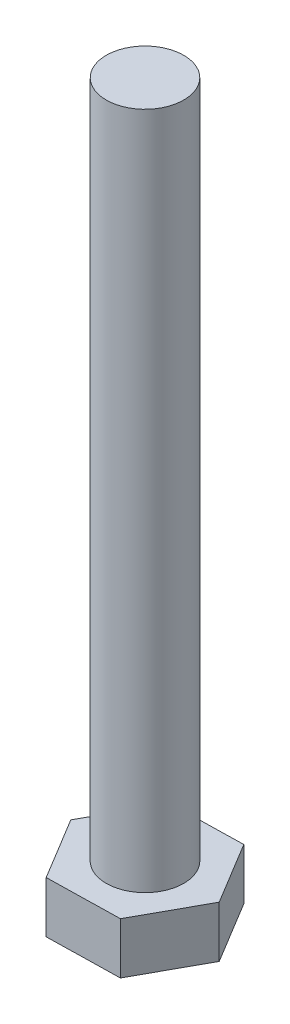
ISO-10303-21;
HEADER;
FILE_DESCRIPTION(('STEP AP214'),'2;1');
FILE_NAME('part.step','',(''),(''),'','','');
FILE_SCHEMA(('AUTOMOTIVE_DESIGN { 1 0 10303 214 1 1 1 1 }'));
ENDSEC;
DATA;
#1=APPLICATION_CONTEXT('core data for automotive mechanical design processes');
#2=APPLICATION_PROTOCOL_DEFINITION('international standard','automotive_design',2000,#1);
#3=PRODUCT_CONTEXT('',#1,'mechanical');
#4=PRODUCT('Part','Part','',(#3));
#5=PRODUCT_RELATED_PRODUCT_CATEGORY('part','',(#4));
#6=PRODUCT_DEFINITION_FORMATION('','',#4);
#7=PRODUCT_DEFINITION_CONTEXT('part definition',#1,'design');
#8=PRODUCT_DEFINITION('design','',#6,#7);
#9=PRODUCT_DEFINITION_SHAPE('','',#8);
#10=(LENGTH_UNIT() NAMED_UNIT(*) SI_UNIT(.MILLI.,.METRE.));
#11=(NAMED_UNIT(*) PLANE_ANGLE_UNIT() SI_UNIT($,.RADIAN.));
#12=(NAMED_UNIT(*) SI_UNIT($,.STERADIAN.) SOLID_ANGLE_UNIT());
#13=UNCERTAINTY_MEASURE_WITH_UNIT(LENGTH_MEASURE(1.E-05),#10,'distance_accuracy_value','');
#14=(GEOMETRIC_REPRESENTATION_CONTEXT(3) GLOBAL_UNCERTAINTY_ASSIGNED_CONTEXT((#13)) GLOBAL_UNIT_ASSIGNED_CONTEXT((#10,
#11,#12)) REPRESENTATION_CONTEXT('',''));
#15=CARTESIAN_POINT('',(0.,0.,0.));
#16=DIRECTION('',(0.,0.,1.));
#17=DIRECTION('',(1.,0.,0.));
#18=AXIS2_PLACEMENT_3D('',#15,#16,#17);
#19=CARTESIAN_POINT('',(-3.62049862835337,5.3,6.57459679489356));
#20=DIRECTION('',(-0.0202323001144248,0.,-0.999795306066237));
#21=DIRECTION('',(-0.999795306066237,0.,0.0202323001144248));
#22=AXIS2_PLACEMENT_3D('',#19,#20,#21);
#23=PLANE('',#22);
#24=DIRECTION('',(0.999795306066237,0.,-0.0202323001144248));
#25=VECTOR('',#24,1.);
#26=CARTESIAN_POINT('',(-3.62049862835337,0.,6.57459679489356));
#27=LINE('',#26,#25);
#28=CARTESIAN_POINT('',(-3.62049862835337,0.,6.57459679489356));
#29=VERTEX_POINT('',#28);
#30=CARTESIAN_POINT('',(3.88351852984089,0.,6.42274218396752));
#31=VERTEX_POINT('',#30);
#32=EDGE_CURVE('E130',#29,#31,#27,.T.);
#33=ORIENTED_EDGE('',*,*,#32,.T.);
#34=DIRECTION('',(0.,-1.,0.));
#35=VECTOR('',#34,1.);
#36=CARTESIAN_POINT('',(3.88351852984089,5.3,6.42274218396752));
#37=LINE('',#36,#35);
#38=CARTESIAN_POINT('',(3.88351852984089,5.3,6.42274218396752));
#39=VERTEX_POINT('',#38);
#40=EDGE_CURVE('E42',#39,#31,#37,.T.);
#41=ORIENTED_EDGE('',*,*,#40,.F.);
#42=DIRECTION('',(0.999795306066237,0.,-0.0202323001144248));
#43=VECTOR('',#42,1.);
#44=CARTESIAN_POINT('',(-3.62049862835337,5.3,6.57459679489356));
#45=LINE('',#44,#43);
#46=CARTESIAN_POINT('',(-3.62049862835337,5.3,6.57459679489356));
#47=VERTEX_POINT('',#46);
#48=EDGE_CURVE('E147',#47,#39,#45,.T.);
#49=ORIENTED_EDGE('',*,*,#48,.F.);
#50=DIRECTION('',(0.,-1.,0.));
#51=VECTOR('',#50,1.);
#52=CARTESIAN_POINT('',(-3.62049862835337,5.3,6.57459679489356));
#53=LINE('',#52,#51);
#54=EDGE_CURVE('E126',#47,#29,#53,.T.);
#55=ORIENTED_EDGE('',*,*,#54,.T.);
#56=EDGE_LOOP('',(#33,#41,#49,#55));
#57=FACE_BOUND('',#56,.T.);
#58=ADVANCED_FACE('F39',(#57),#23,.F.);
#59=CARTESIAN_POINT('',(3.88351852984089,5.3,6.42274218396752));
#60=DIRECTION('',(-0.875964283695011,0.,-0.482375967157036));
#61=DIRECTION('',(-0.482375967157036,0.,0.875964283695011));
#62=AXIS2_PLACEMENT_3D('',#59,#60,#61);
#63=PLANE('',#62);
#64=DIRECTION('',(0.482375967157036,0.,-0.875964283695011));
#65=VECTOR('',#64,1.);
#66=CARTESIAN_POINT('',(3.88351852984089,0.,6.42274218396752));
#67=LINE('',#66,#65);
#68=CARTESIAN_POINT('',(7.50401715819426,0.,-0.151854610926049));
#69=VERTEX_POINT('',#68);
#70=EDGE_CURVE('E134',#31,#69,#67,.T.);
#71=ORIENTED_EDGE('',*,*,#70,.T.);
#72=DIRECTION('',(0.,-1.,0.));
#73=VECTOR('',#72,1.);
#74=CARTESIAN_POINT('',(7.50401715819426,5.3,-0.151854610926049));
#75=LINE('',#74,#73);
#76=CARTESIAN_POINT('',(7.50401715819426,5.3,-0.151854610926049));
#77=VERTEX_POINT('',#76);
#78=EDGE_CURVE('E153',#77,#69,#75,.T.);
#79=ORIENTED_EDGE('',*,*,#78,.F.);
#80=DIRECTION('',(0.482375967157036,0.,-0.875964283695011));
#81=VECTOR('',#80,1.);
#82=CARTESIAN_POINT('',(3.88351852984089,5.3,6.42274218396752));
#83=LINE('',#82,#81);
#84=EDGE_CURVE('E95',#39,#77,#83,.T.);
#85=ORIENTED_EDGE('',*,*,#84,.F.);
#86=ORIENTED_EDGE('',*,*,#40,.T.);
#87=EDGE_LOOP('',(#71,#79,#85,#86));
#88=FACE_BOUND('',#87,.T.);
#89=ADVANCED_FACE('F160',(#88),#63,.F.);
#90=CARTESIAN_POINT('',(7.50401715819426,5.3,-0.151854610926049));
#91=DIRECTION('',(-0.855731983580587,0.,0.517419338909201));
#92=DIRECTION('',(0.517419338909201,0.,0.855731983580587));
#93=AXIS2_PLACEMENT_3D('',#90,#91,#92);
#94=PLANE('',#93);
#95=DIRECTION('',(-0.517419338909201,0.,-0.855731983580587));
#96=VECTOR('',#95,1.);
#97=CARTESIAN_POINT('',(7.50401715819426,0.,-0.151854610926049));
#98=LINE('',#97,#96);
#99=CARTESIAN_POINT('',(3.62049862835337,0.,-6.57459679489356));
#100=VERTEX_POINT('',#99);
#101=EDGE_CURVE('E138',#69,#100,#98,.T.);
#102=ORIENTED_EDGE('',*,*,#101,.T.);
#103=DIRECTION('',(0.,-1.,0.));
#104=VECTOR('',#103,1.);
#105=CARTESIAN_POINT('',(3.62049862835337,5.3,-6.57459679489356));
#106=LINE('',#105,#104);
#107=CARTESIAN_POINT('',(3.62049862835337,5.3,-6.57459679489356));
#108=VERTEX_POINT('',#107);
#109=EDGE_CURVE('E119',#108,#100,#106,.T.);
#110=ORIENTED_EDGE('',*,*,#109,.F.);
#111=DIRECTION('',(-0.517419338909201,0.,-0.855731983580587));
#112=VECTOR('',#111,1.);
#113=CARTESIAN_POINT('',(7.50401715819426,5.3,-0.151854610926049));
#114=LINE('',#113,#112);
#115=EDGE_CURVE('E108',#77,#108,#114,.T.);
#116=ORIENTED_EDGE('',*,*,#115,.F.);
#117=ORIENTED_EDGE('',*,*,#78,.T.);
#118=EDGE_LOOP('',(#102,#110,#116,#117));
#119=FACE_BOUND('',#118,.T.);
#120=ADVANCED_FACE('F166',(#119),#94,.F.);
#121=CARTESIAN_POINT('',(3.62049862835337,5.3,-6.57459679489356));
#122=DIRECTION('',(0.0202323001144248,0.,0.999795306066237));
#123=DIRECTION('',(0.999795306066237,0.,-0.0202323001144248));
#124=AXIS2_PLACEMENT_3D('',#121,#122,#123);
#125=PLANE('',#124);
#126=DIRECTION('',(-0.999795306066237,0.,0.0202323001144248));
#127=VECTOR('',#126,1.);
#128=CARTESIAN_POINT('',(3.62049862835337,0.,-6.57459679489356));
#129=LINE('',#128,#127);
#130=CARTESIAN_POINT('',(-3.88351852984089,0.,-6.42274218396751));
#131=VERTEX_POINT('',#130);
#132=EDGE_CURVE('E117',#100,#131,#129,.T.);
#133=ORIENTED_EDGE('',*,*,#132,.T.);
#134=DIRECTION('',(0.,-1.,0.));
#135=VECTOR('',#134,1.);
#136=CARTESIAN_POINT('',(-3.88351852984089,5.3,-6.42274218396751));
#137=LINE('',#136,#135);
#138=CARTESIAN_POINT('',(-3.88351852984089,5.3,-6.42274218396751));
#139=VERTEX_POINT('',#138);
#140=EDGE_CURVE('E114',#139,#131,#137,.T.);
#141=ORIENTED_EDGE('',*,*,#140,.F.);
#142=DIRECTION('',(-0.999795306066237,0.,0.0202323001144248));
#143=VECTOR('',#142,1.);
#144=CARTESIAN_POINT('',(3.62049862835337,5.3,-6.57459679489356));
#145=LINE('',#144,#143);
#146=EDGE_CURVE('E102',#108,#139,#145,.T.);
#147=ORIENTED_EDGE('',*,*,#146,.F.);
#148=ORIENTED_EDGE('',*,*,#109,.T.);
#149=EDGE_LOOP('',(#133,#141,#147,#148));
#150=FACE_BOUND('',#149,.T.);
#151=ADVANCED_FACE('F115',(#150),#125,.F.);
#152=CARTESIAN_POINT('',(-3.88351852984089,5.3,-6.42274218396751));
#153=DIRECTION('',(0.875964283695011,0.,0.482375967157036));
#154=DIRECTION('',(0.482375967157036,0.,-0.875964283695011));
#155=AXIS2_PLACEMENT_3D('',#152,#153,#154);
#156=PLANE('',#155);
#157=DIRECTION('',(-0.482375967157036,0.,0.875964283695011));
#158=VECTOR('',#157,1.);
#159=CARTESIAN_POINT('',(-3.88351852984089,0.,-6.42274218396751));
#160=LINE('',#159,#158);
#161=CARTESIAN_POINT('',(-7.50401715819426,0.,0.151854610926049));
#162=VERTEX_POINT('',#161);
#163=EDGE_CURVE('E80',#131,#162,#160,.T.);
#164=ORIENTED_EDGE('',*,*,#163,.T.);
#165=DIRECTION('',(0.,-1.,0.));
#166=VECTOR('',#165,1.);
#167=CARTESIAN_POINT('',(-7.50401715819426,5.3,0.151854610926049));
#168=LINE('',#167,#166);
#169=CARTESIAN_POINT('',(-7.50401715819426,5.3,0.151854610926049));
#170=VERTEX_POINT('',#169);
#171=EDGE_CURVE('E120',#170,#162,#168,.T.);
#172=ORIENTED_EDGE('',*,*,#171,.F.);
#173=DIRECTION('',(-0.482375967157036,0.,0.875964283695011));
#174=VECTOR('',#173,1.);
#175=CARTESIAN_POINT('',(-3.88351852984089,5.3,-6.42274218396751));
#176=LINE('',#175,#174);
#177=EDGE_CURVE('E106',#139,#170,#176,.T.);
#178=ORIENTED_EDGE('',*,*,#177,.F.);
#179=ORIENTED_EDGE('',*,*,#140,.T.);
#180=EDGE_LOOP('',(#164,#172,#178,#179));
#181=FACE_BOUND('',#180,.T.);
#182=ADVANCED_FACE('F122',(#181),#156,.F.);
#183=CARTESIAN_POINT('',(-7.50401715819426,5.3,0.151854610926049));
#184=DIRECTION('',(0.855731983580587,0.,-0.517419338909201));
#185=DIRECTION('',(-0.517419338909201,0.,-0.855731983580587));
#186=AXIS2_PLACEMENT_3D('',#183,#184,#185);
#187=PLANE('',#186);
#188=DIRECTION('',(0.517419338909201,0.,0.855731983580587));
#189=VECTOR('',#188,1.);
#190=CARTESIAN_POINT('',(-7.50401715819426,0.,0.151854610926049));
#191=LINE('',#190,#189);
#192=EDGE_CURVE('E86',#162,#29,#191,.T.);
#193=ORIENTED_EDGE('',*,*,#192,.T.);
#194=ORIENTED_EDGE('',*,*,#54,.F.);
#195=DIRECTION('',(0.517419338909201,0.,0.855731983580587));
#196=VECTOR('',#195,1.);
#197=CARTESIAN_POINT('',(-7.50401715819426,5.3,0.151854610926049));
#198=LINE('',#197,#196);
#199=EDGE_CURVE('E57',#170,#47,#198,.T.);
#200=ORIENTED_EDGE('',*,*,#199,.F.);
#201=ORIENTED_EDGE('',*,*,#171,.T.);
#202=EDGE_LOOP('',(#193,#194,#200,#201));
#203=FACE_BOUND('',#202,.T.);
#204=ADVANCED_FACE('F186',(#203),#187,.F.);
#205=CARTESIAN_POINT('',(0.,5.3,0.));
#206=DIRECTION('',(0.,1.,0.));
#207=DIRECTION('',(0.,0.,1.));
#208=AXIS2_PLACEMENT_3D('',#205,#206,#207);
#209=PLANE('',#208);
#210=CARTESIAN_POINT('',(0.,5.3,0.));
#211=DIRECTION('',(0.,1.,0.));
#212=DIRECTION('',(0.,0.,1.));
#213=AXIS2_PLACEMENT_3D('',#210,#211,#212);
#214=CIRCLE('',#213,4.);
#215=CARTESIAN_POINT('',(0.,5.3,4.));
#216=VERTEX_POINT('',#215);
#217=EDGE_CURVE('E11',#216,#216,#214,.T.);
#218=ORIENTED_EDGE('',*,*,#217,.F.);
#219=EDGE_LOOP('',(#218));
#220=FACE_BOUND('',#219,.T.);
#221=ORIENTED_EDGE('',*,*,#48,.T.);
#222=ORIENTED_EDGE('',*,*,#84,.T.);
#223=ORIENTED_EDGE('',*,*,#115,.T.);
#224=ORIENTED_EDGE('',*,*,#146,.T.);
#225=ORIENTED_EDGE('',*,*,#177,.T.);
#226=ORIENTED_EDGE('',*,*,#199,.T.);
#227=EDGE_LOOP('',(#221,#222,#223,#224,#225,#226));
#228=FACE_BOUND('',#227,.T.);
#229=ADVANCED_FACE('F104',(#220,#228),#209,.T.);
#230=CARTESIAN_POINT('',(0.,0.,0.));
#231=DIRECTION('',(0.,1.,0.));
#232=DIRECTION('',(0.,0.,1.));
#233=AXIS2_PLACEMENT_3D('',#230,#231,#232);
#234=PLANE('',#233);
#235=ORIENTED_EDGE('',*,*,#32,.F.);
#236=ORIENTED_EDGE('',*,*,#192,.F.);
#237=ORIENTED_EDGE('',*,*,#163,.F.);
#238=ORIENTED_EDGE('',*,*,#132,.F.);
#239=ORIENTED_EDGE('',*,*,#101,.F.);
#240=ORIENTED_EDGE('',*,*,#70,.F.);
#241=EDGE_LOOP('',(#235,#236,#237,#238,#239,#240));
#242=FACE_BOUND('',#241,.T.);
#243=ADVANCED_FACE('F165',(#242),#234,.F.);
#244=CARTESIAN_POINT('',(0.,75.3,0.));
#245=DIRECTION('',(0.,-1.,0.));
#246=DIRECTION('',(0.,0.,-1.));
#247=AXIS2_PLACEMENT_3D('',#244,#245,#246);
#248=CYLINDRICAL_SURFACE('',#247,4.);
#249=CARTESIAN_POINT('',(0.,75.3,0.));
#250=DIRECTION('',(0.,1.,0.));
#251=DIRECTION('',(0.,0.,1.));
#252=AXIS2_PLACEMENT_3D('',#249,#250,#251);
#253=CIRCLE('',#252,4.);
#254=CARTESIAN_POINT('',(0.,75.3,4.));
#255=VERTEX_POINT('',#254);
#256=EDGE_CURVE('E135',#255,#255,#253,.T.);
#257=ORIENTED_EDGE('',*,*,#256,.F.);
#258=EDGE_LOOP('',(#257));
#259=FACE_BOUND('',#258,.T.);
#260=ORIENTED_EDGE('',*,*,#217,.T.);
#261=EDGE_LOOP('',(#260));
#262=FACE_BOUND('',#261,.T.);
#263=ADVANCED_FACE('F179',(#259,#262),#248,.T.);
#264=CARTESIAN_POINT('',(0.,75.3,0.));
#265=DIRECTION('',(0.,1.,0.));
#266=DIRECTION('',(0.,0.,1.));
#267=AXIS2_PLACEMENT_3D('',#264,#265,#266);
#268=PLANE('',#267);
#269=ORIENTED_EDGE('',*,*,#256,.T.);
#270=EDGE_LOOP('',(#269));
#271=FACE_BOUND('',#270,.T.);
#272=ADVANCED_FACE('F177',(#271),#268,.T.);
#273=CLOSED_SHELL('',(#58,#89,#120,#151,#182,#204,#229,#243,#263,#272));
#274=MANIFOLD_SOLID_BREP('B2',#273);
#275=ADVANCED_BREP_SHAPE_REPRESENTATION('',(#18,#274),#14);
#276=SHAPE_DEFINITION_REPRESENTATION(#9,#275);
ENDSEC;
END-ISO-10303-21;
